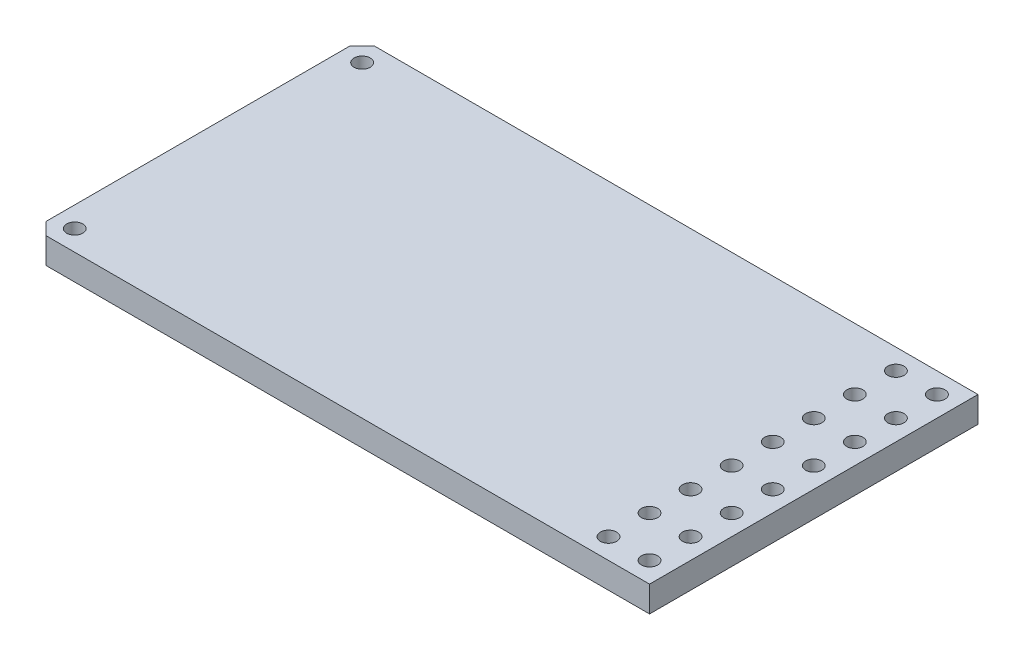
ISO-10303-21;
HEADER;
FILE_DESCRIPTION(('STEP AP214'),'2;1');
FILE_NAME('part.step','',(''),(''),'','','');
FILE_SCHEMA(('AUTOMOTIVE_DESIGN { 1 0 10303 214 1 1 1 1 }'));
ENDSEC;
DATA;
#1=APPLICATION_CONTEXT('core data for automotive mechanical design processes');
#2=APPLICATION_PROTOCOL_DEFINITION('international standard','automotive_design',2000,#1);
#3=PRODUCT_CONTEXT('',#1,'mechanical');
#4=PRODUCT('Part','Part','',(#3));
#5=PRODUCT_RELATED_PRODUCT_CATEGORY('part','',(#4));
#6=PRODUCT_DEFINITION_FORMATION('','',#4);
#7=PRODUCT_DEFINITION_CONTEXT('part definition',#1,'design');
#8=PRODUCT_DEFINITION('design','',#6,#7);
#9=PRODUCT_DEFINITION_SHAPE('','',#8);
#10=(LENGTH_UNIT() NAMED_UNIT(*) SI_UNIT(.MILLI.,.METRE.));
#11=(NAMED_UNIT(*) PLANE_ANGLE_UNIT() SI_UNIT($,.RADIAN.));
#12=(NAMED_UNIT(*) SI_UNIT($,.STERADIAN.) SOLID_ANGLE_UNIT());
#13=UNCERTAINTY_MEASURE_WITH_UNIT(LENGTH_MEASURE(1.E-05),#10,'distance_accuracy_value','');
#14=(GEOMETRIC_REPRESENTATION_CONTEXT(3) GLOBAL_UNCERTAINTY_ASSIGNED_CONTEXT((#13)) GLOBAL_UNIT_ASSIGNED_CONTEXT((#10,
#11,#12)) REPRESENTATION_CONTEXT('',''));
#15=CARTESIAN_POINT('',(0.,0.,0.));
#16=DIRECTION('',(0.,0.,1.));
#17=DIRECTION('',(1.,0.,0.));
#18=AXIS2_PLACEMENT_3D('',#15,#16,#17);
#19=CARTESIAN_POINT('',(-14.224,0.8,14.224));
#20=DIRECTION('',(-0.707106781186548,0.,0.707106781186547));
#21=DIRECTION('',(0.707106781186547,0.,0.707106781186548));
#22=AXIS2_PLACEMENT_3D('',#19,#20,#21);
#23=PLANE('',#22);
#24=DIRECTION('',(-0.707106781186547,0.,-0.707106781186548));
#25=VECTOR('',#24,1.);
#26=CARTESIAN_POINT('',(-14.224,-0.8,14.224));
#27=LINE('',#26,#25);
#28=CARTESIAN_POINT('',(-18.288,-0.8,10.16));
#29=VERTEX_POINT('',#28);
#30=CARTESIAN_POINT('',(-19.05,-0.8,9.39799999999999));
#31=VERTEX_POINT('',#30);
#32=EDGE_CURVE('E206',#29,#31,#27,.T.);
#33=ORIENTED_EDGE('',*,*,#32,.F.);
#34=DIRECTION('',(0.,-1.,0.));
#35=VECTOR('',#34,1.);
#36=CARTESIAN_POINT('',(-18.288,0.8,10.16));
#37=LINE('',#36,#35);
#38=CARTESIAN_POINT('',(-18.288,0.8,10.16));
#39=VERTEX_POINT('',#38);
#40=EDGE_CURVE('E11',#39,#29,#37,.T.);
#41=ORIENTED_EDGE('',*,*,#40,.F.);
#42=DIRECTION('',(-0.707106781186547,0.,-0.707106781186548));
#43=VECTOR('',#42,1.);
#44=CARTESIAN_POINT('',(-14.224,0.8,14.224));
#45=LINE('',#44,#43);
#46=CARTESIAN_POINT('',(-19.05,0.8,9.39799999999999));
#47=VERTEX_POINT('',#46);
#48=EDGE_CURVE('E617',#39,#47,#45,.T.);
#49=ORIENTED_EDGE('',*,*,#48,.T.);
#50=DIRECTION('',(0.,-1.,0.));
#51=VECTOR('',#50,1.);
#52=CARTESIAN_POINT('',(-19.05,0.8,9.39799999999999));
#53=LINE('',#52,#51);
#54=EDGE_CURVE('E61',#47,#31,#53,.T.);
#55=ORIENTED_EDGE('',*,*,#54,.T.);
#56=EDGE_LOOP('',(#33,#41,#49,#55));
#57=FACE_BOUND('',#56,.T.);
#58=ADVANCED_FACE('F43',(#57),#23,.T.);
#59=CARTESIAN_POINT('',(0.,0.8,10.16));
#60=DIRECTION('',(0.,0.,-1.));
#61=DIRECTION('',(-1.,0.,0.));
#62=AXIS2_PLACEMENT_3D('',#59,#60,#61);
#63=PLANE('',#62);
#64=DIRECTION('',(1.,0.,0.));
#65=VECTOR('',#64,1.);
#66=CARTESIAN_POINT('',(0.,-0.8,10.16));
#67=LINE('',#66,#65);
#68=CARTESIAN_POINT('',(19.05,-0.8,10.16));
#69=VERTEX_POINT('',#68);
#70=EDGE_CURVE('E209',#29,#69,#67,.T.);
#71=ORIENTED_EDGE('',*,*,#70,.T.);
#72=DIRECTION('',(0.,-1.,0.));
#73=VECTOR('',#72,1.);
#74=CARTESIAN_POINT('',(19.05,0.8,10.16));
#75=LINE('',#74,#73);
#76=CARTESIAN_POINT('',(19.05,0.8,10.16));
#77=VERTEX_POINT('',#76);
#78=EDGE_CURVE('E53',#77,#69,#75,.T.);
#79=ORIENTED_EDGE('',*,*,#78,.F.);
#80=DIRECTION('',(1.,0.,0.));
#81=VECTOR('',#80,1.);
#82=CARTESIAN_POINT('',(0.,0.8,10.16));
#83=LINE('',#82,#81);
#84=EDGE_CURVE('E128',#39,#77,#83,.T.);
#85=ORIENTED_EDGE('',*,*,#84,.F.);
#86=ORIENTED_EDGE('',*,*,#40,.T.);
#87=EDGE_LOOP('',(#71,#79,#85,#86));
#88=FACE_BOUND('',#87,.T.);
#89=ADVANCED_FACE('F247',(#88),#63,.F.);
#90=CARTESIAN_POINT('',(19.05,0.8,0.));
#91=DIRECTION('',(-1.,0.,0.));
#92=DIRECTION('',(0.,0.,1.));
#93=AXIS2_PLACEMENT_3D('',#90,#91,#92);
#94=PLANE('',#93);
#95=DIRECTION('',(0.,0.,-1.));
#96=VECTOR('',#95,1.);
#97=CARTESIAN_POINT('',(19.05,-0.8,0.));
#98=LINE('',#97,#96);
#99=CARTESIAN_POINT('',(19.05,-0.8,-10.16));
#100=VERTEX_POINT('',#99);
#101=EDGE_CURVE('E213',#69,#100,#98,.T.);
#102=ORIENTED_EDGE('',*,*,#101,.T.);
#103=DIRECTION('',(0.,-1.,0.));
#104=VECTOR('',#103,1.);
#105=CARTESIAN_POINT('',(19.05,0.8,-10.16));
#106=LINE('',#105,#104);
#107=CARTESIAN_POINT('',(19.05,0.8,-10.16));
#108=VERTEX_POINT('',#107);
#109=EDGE_CURVE('E110',#108,#100,#106,.T.);
#110=ORIENTED_EDGE('',*,*,#109,.F.);
#111=DIRECTION('',(0.,0.,-1.));
#112=VECTOR('',#111,1.);
#113=CARTESIAN_POINT('',(19.05,0.8,0.));
#114=LINE('',#113,#112);
#115=EDGE_CURVE('E123',#77,#108,#114,.T.);
#116=ORIENTED_EDGE('',*,*,#115,.F.);
#117=ORIENTED_EDGE('',*,*,#78,.T.);
#118=EDGE_LOOP('',(#102,#110,#116,#117));
#119=FACE_BOUND('',#118,.T.);
#120=ADVANCED_FACE('F244',(#119),#94,.F.);
#121=CARTESIAN_POINT('',(0.,0.8,-10.16));
#122=DIRECTION('',(0.,0.,-1.));
#123=DIRECTION('',(-1.,0.,0.));
#124=AXIS2_PLACEMENT_3D('',#121,#122,#123);
#125=PLANE('',#124);
#126=DIRECTION('',(1.,0.,0.));
#127=VECTOR('',#126,1.);
#128=CARTESIAN_POINT('',(0.,-0.8,-10.16));
#129=LINE('',#128,#127);
#130=CARTESIAN_POINT('',(-18.288,-0.8,-10.16));
#131=VERTEX_POINT('',#130);
#132=EDGE_CURVE('E106',#131,#100,#129,.T.);
#133=ORIENTED_EDGE('',*,*,#132,.F.);
#134=DIRECTION('',(0.,-1.,0.));
#135=VECTOR('',#134,1.);
#136=CARTESIAN_POINT('',(-18.288,0.8,-10.16));
#137=LINE('',#136,#135);
#138=CARTESIAN_POINT('',(-18.288,0.8,-10.16));
#139=VERTEX_POINT('',#138);
#140=EDGE_CURVE('E100',#139,#131,#137,.T.);
#141=ORIENTED_EDGE('',*,*,#140,.F.);
#142=DIRECTION('',(1.,0.,0.));
#143=VECTOR('',#142,1.);
#144=CARTESIAN_POINT('',(0.,0.8,-10.16));
#145=LINE('',#144,#143);
#146=EDGE_CURVE('E104',#139,#108,#145,.T.);
#147=ORIENTED_EDGE('',*,*,#146,.T.);
#148=ORIENTED_EDGE('',*,*,#109,.T.);
#149=EDGE_LOOP('',(#133,#141,#147,#148));
#150=FACE_BOUND('',#149,.T.);
#151=ADVANCED_FACE('F102',(#150),#125,.T.);
#152=CARTESIAN_POINT('',(-14.224,0.8,-14.224));
#153=DIRECTION('',(0.707106781186548,0.,0.707106781186547));
#154=DIRECTION('',(0.707106781186547,0.,-0.707106781186548));
#155=AXIS2_PLACEMENT_3D('',#152,#153,#154);
#156=PLANE('',#155);
#157=DIRECTION('',(-0.707106781186547,0.,0.707106781186548));
#158=VECTOR('',#157,1.);
#159=CARTESIAN_POINT('',(-14.224,-0.8,-14.224));
#160=LINE('',#159,#158);
#161=CARTESIAN_POINT('',(-19.05,-0.8,-9.39799999999999));
#162=VERTEX_POINT('',#161);
#163=EDGE_CURVE('E219',#131,#162,#160,.T.);
#164=ORIENTED_EDGE('',*,*,#163,.T.);
#165=DIRECTION('',(0.,-1.,0.));
#166=VECTOR('',#165,1.);
#167=CARTESIAN_POINT('',(-19.05,0.8,-9.39799999999999));
#168=LINE('',#167,#166);
#169=CARTESIAN_POINT('',(-19.05,0.8,-9.39799999999999));
#170=VERTEX_POINT('',#169);
#171=EDGE_CURVE('E81',#170,#162,#168,.T.);
#172=ORIENTED_EDGE('',*,*,#171,.F.);
#173=DIRECTION('',(-0.707106781186547,0.,0.707106781186548));
#174=VECTOR('',#173,1.);
#175=CARTESIAN_POINT('',(-14.224,0.8,-14.224));
#176=LINE('',#175,#174);
#177=EDGE_CURVE('E112',#139,#170,#176,.T.);
#178=ORIENTED_EDGE('',*,*,#177,.F.);
#179=ORIENTED_EDGE('',*,*,#140,.T.);
#180=EDGE_LOOP('',(#164,#172,#178,#179));
#181=FACE_BOUND('',#180,.T.);
#182=ADVANCED_FACE('F113',(#181),#156,.F.);
#183=CARTESIAN_POINT('',(-17.78,0.8,-8.89));
#184=DIRECTION('',(0.,-1.,0.));
#185=DIRECTION('',(0.,0.,-1.));
#186=AXIS2_PLACEMENT_3D('',#183,#184,#185);
#187=CYLINDRICAL_SURFACE('',#186,0.499999999999999);
#188=CARTESIAN_POINT('',(-17.78,0.8,-8.89));
#189=DIRECTION('',(0.,1.,0.));
#190=DIRECTION('',(0.,0.,1.));
#191=AXIS2_PLACEMENT_3D('',#188,#189,#190);
#192=CIRCLE('',#191,0.499999999999999);
#193=CARTESIAN_POINT('',(-17.78,0.8,-8.39));
#194=VERTEX_POINT('',#193);
#195=EDGE_CURVE('E134',#194,#194,#192,.T.);
#196=ORIENTED_EDGE('',*,*,#195,.T.);
#197=EDGE_LOOP('',(#196));
#198=FACE_BOUND('',#197,.T.);
#199=CARTESIAN_POINT('',(-17.78,-0.8,-8.89));
#200=DIRECTION('',(0.,1.,0.));
#201=DIRECTION('',(0.,0.,1.));
#202=AXIS2_PLACEMENT_3D('',#199,#200,#201);
#203=CIRCLE('',#202,0.499999999999999);
#204=CARTESIAN_POINT('',(-17.78,-0.8,-8.39));
#205=VERTEX_POINT('',#204);
#206=EDGE_CURVE('E226',#205,#205,#203,.T.);
#207=ORIENTED_EDGE('',*,*,#206,.F.);
#208=EDGE_LOOP('',(#207));
#209=FACE_BOUND('',#208,.T.);
#210=ADVANCED_FACE('F383',(#198,#209),#187,.F.);
#211=CARTESIAN_POINT('',(-19.05,0.8,0.));
#212=DIRECTION('',(-1.,0.,0.));
#213=DIRECTION('',(0.,0.,1.));
#214=AXIS2_PLACEMENT_3D('',#211,#212,#213);
#215=PLANE('',#214);
#216=DIRECTION('',(0.,0.,-1.));
#217=VECTOR('',#216,1.);
#218=CARTESIAN_POINT('',(-19.05,-0.8,0.));
#219=LINE('',#218,#217);
#220=EDGE_CURVE('E222',#31,#162,#219,.T.);
#221=ORIENTED_EDGE('',*,*,#220,.F.);
#222=ORIENTED_EDGE('',*,*,#54,.F.);
#223=DIRECTION('',(0.,0.,-1.));
#224=VECTOR('',#223,1.);
#225=CARTESIAN_POINT('',(-19.05,0.8,0.));
#226=LINE('',#225,#224);
#227=EDGE_CURVE('E117',#47,#170,#226,.T.);
#228=ORIENTED_EDGE('',*,*,#227,.T.);
#229=ORIENTED_EDGE('',*,*,#171,.T.);
#230=EDGE_LOOP('',(#221,#222,#228,#229));
#231=FACE_BOUND('',#230,.T.);
#232=ADVANCED_FACE('F263',(#231),#215,.T.);
#233=CARTESIAN_POINT('',(17.78,0.8,-8.89));
#234=DIRECTION('',(0.,-1.,0.));
#235=DIRECTION('',(0.,0.,-1.));
#236=AXIS2_PLACEMENT_3D('',#233,#234,#235);
#237=CYLINDRICAL_SURFACE('',#236,0.499999999999999);
#238=CARTESIAN_POINT('',(17.78,0.8,-8.89));
#239=DIRECTION('',(0.,1.,0.));
#240=DIRECTION('',(0.,0.,1.));
#241=AXIS2_PLACEMENT_3D('',#238,#239,#240);
#242=CIRCLE('',#241,0.499999999999999);
#243=CARTESIAN_POINT('',(17.78,0.8,-8.39));
#244=VERTEX_POINT('',#243);
#245=EDGE_CURVE('E615',#244,#244,#242,.T.);
#246=ORIENTED_EDGE('',*,*,#245,.T.);
#247=EDGE_LOOP('',(#246));
#248=FACE_BOUND('',#247,.T.);
#249=CARTESIAN_POINT('',(17.78,-0.8,-8.89));
#250=DIRECTION('',(0.,1.,0.));
#251=DIRECTION('',(0.,0.,1.));
#252=AXIS2_PLACEMENT_3D('',#249,#250,#251);
#253=CIRCLE('',#252,0.499999999999999);
#254=CARTESIAN_POINT('',(17.78,-0.8,-8.39));
#255=VERTEX_POINT('',#254);
#256=EDGE_CURVE('E202',#255,#255,#253,.T.);
#257=ORIENTED_EDGE('',*,*,#256,.F.);
#258=EDGE_LOOP('',(#257));
#259=FACE_BOUND('',#258,.T.);
#260=ADVANCED_FACE('F259',(#248,#259),#237,.F.);
#261=CARTESIAN_POINT('',(15.24,0.8,-8.89));
#262=DIRECTION('',(0.,-1.,0.));
#263=DIRECTION('',(0.,0.,-1.));
#264=AXIS2_PLACEMENT_3D('',#261,#262,#263);
#265=CYLINDRICAL_SURFACE('',#264,0.499999999999995);
#266=CARTESIAN_POINT('',(15.24,0.8,-8.89));
#267=DIRECTION('',(0.,1.,0.));
#268=DIRECTION('',(0.,0.,1.));
#269=AXIS2_PLACEMENT_3D('',#266,#267,#268);
#270=CIRCLE('',#269,0.499999999999995);
#271=CARTESIAN_POINT('',(15.24,0.8,-8.39));
#272=VERTEX_POINT('',#271);
#273=EDGE_CURVE('E612',#272,#272,#270,.T.);
#274=ORIENTED_EDGE('',*,*,#273,.T.);
#275=EDGE_LOOP('',(#274));
#276=FACE_BOUND('',#275,.T.);
#277=CARTESIAN_POINT('',(15.24,-0.8,-8.89));
#278=DIRECTION('',(0.,1.,0.));
#279=DIRECTION('',(0.,0.,1.));
#280=AXIS2_PLACEMENT_3D('',#277,#278,#279);
#281=CIRCLE('',#280,0.499999999999995);
#282=CARTESIAN_POINT('',(15.24,-0.8,-8.39));
#283=VERTEX_POINT('',#282);
#284=EDGE_CURVE('E198',#283,#283,#281,.T.);
#285=ORIENTED_EDGE('',*,*,#284,.F.);
#286=EDGE_LOOP('',(#285));
#287=FACE_BOUND('',#286,.T.);
#288=ADVANCED_FACE('F262',(#276,#287),#265,.F.);
#289=CARTESIAN_POINT('',(15.24,0.8,-6.35));
#290=DIRECTION('',(0.,-1.,0.));
#291=DIRECTION('',(0.,0.,-1.));
#292=AXIS2_PLACEMENT_3D('',#289,#290,#291);
#293=CYLINDRICAL_SURFACE('',#292,0.499999999999997);
#294=CARTESIAN_POINT('',(15.24,0.8,-6.35));
#295=DIRECTION('',(0.,1.,0.));
#296=DIRECTION('',(0.,0.,1.));
#297=AXIS2_PLACEMENT_3D('',#294,#295,#296);
#298=CIRCLE('',#297,0.499999999999997);
#299=CARTESIAN_POINT('',(15.24,0.8,-5.85));
#300=VERTEX_POINT('',#299);
#301=EDGE_CURVE('E608',#300,#300,#298,.T.);
#302=ORIENTED_EDGE('',*,*,#301,.T.);
#303=EDGE_LOOP('',(#302));
#304=FACE_BOUND('',#303,.T.);
#305=CARTESIAN_POINT('',(15.24,-0.8,-6.35));
#306=DIRECTION('',(0.,1.,0.));
#307=DIRECTION('',(0.,0.,1.));
#308=AXIS2_PLACEMENT_3D('',#305,#306,#307);
#309=CIRCLE('',#308,0.499999999999997);
#310=CARTESIAN_POINT('',(15.24,-0.8,-5.85));
#311=VERTEX_POINT('',#310);
#312=EDGE_CURVE('E194',#311,#311,#309,.T.);
#313=ORIENTED_EDGE('',*,*,#312,.F.);
#314=EDGE_LOOP('',(#313));
#315=FACE_BOUND('',#314,.T.);
#316=ADVANCED_FACE('F267',(#304,#315),#293,.F.);
#317=CARTESIAN_POINT('',(17.78,0.8,-6.35));
#318=DIRECTION('',(0.,-1.,0.));
#319=DIRECTION('',(0.,0.,-1.));
#320=AXIS2_PLACEMENT_3D('',#317,#318,#319);
#321=CYLINDRICAL_SURFACE('',#320,0.499999999999999);
#322=CARTESIAN_POINT('',(17.78,0.8,-6.35));
#323=DIRECTION('',(0.,1.,0.));
#324=DIRECTION('',(0.,0.,1.));
#325=AXIS2_PLACEMENT_3D('',#322,#323,#324);
#326=CIRCLE('',#325,0.499999999999999);
#327=CARTESIAN_POINT('',(17.78,0.8,-5.85));
#328=VERTEX_POINT('',#327);
#329=EDGE_CURVE('E604',#328,#328,#326,.T.);
#330=ORIENTED_EDGE('',*,*,#329,.T.);
#331=EDGE_LOOP('',(#330));
#332=FACE_BOUND('',#331,.T.);
#333=CARTESIAN_POINT('',(17.78,-0.8,-6.35));
#334=DIRECTION('',(0.,1.,0.));
#335=DIRECTION('',(0.,0.,1.));
#336=AXIS2_PLACEMENT_3D('',#333,#334,#335);
#337=CIRCLE('',#336,0.499999999999999);
#338=CARTESIAN_POINT('',(17.78,-0.8,-5.85));
#339=VERTEX_POINT('',#338);
#340=EDGE_CURVE('E190',#339,#339,#337,.T.);
#341=ORIENTED_EDGE('',*,*,#340,.F.);
#342=EDGE_LOOP('',(#341));
#343=FACE_BOUND('',#342,.T.);
#344=ADVANCED_FACE('F271',(#332,#343),#321,.F.);
#345=CARTESIAN_POINT('',(15.24,0.8,-3.81));
#346=DIRECTION('',(0.,-1.,0.));
#347=DIRECTION('',(0.,0.,-1.));
#348=AXIS2_PLACEMENT_3D('',#345,#346,#347);
#349=CYLINDRICAL_SURFACE('',#348,0.499999999999996);
#350=CARTESIAN_POINT('',(15.24,0.8,-3.81));
#351=DIRECTION('',(0.,1.,0.));
#352=DIRECTION('',(0.,0.,1.));
#353=AXIS2_PLACEMENT_3D('',#350,#351,#352);
#354=CIRCLE('',#353,0.499999999999996);
#355=CARTESIAN_POINT('',(15.24,0.8,-3.31));
#356=VERTEX_POINT('',#355);
#357=EDGE_CURVE('E600',#356,#356,#354,.T.);
#358=ORIENTED_EDGE('',*,*,#357,.T.);
#359=EDGE_LOOP('',(#358));
#360=FACE_BOUND('',#359,.T.);
#361=CARTESIAN_POINT('',(15.24,-0.8,-3.81));
#362=DIRECTION('',(0.,1.,0.));
#363=DIRECTION('',(0.,0.,1.));
#364=AXIS2_PLACEMENT_3D('',#361,#362,#363);
#365=CIRCLE('',#364,0.499999999999996);
#366=CARTESIAN_POINT('',(15.24,-0.8,-3.31));
#367=VERTEX_POINT('',#366);
#368=EDGE_CURVE('E186',#367,#367,#365,.T.);
#369=ORIENTED_EDGE('',*,*,#368,.F.);
#370=EDGE_LOOP('',(#369));
#371=FACE_BOUND('',#370,.T.);
#372=ADVANCED_FACE('F275',(#360,#371),#349,.F.);
#373=CARTESIAN_POINT('',(17.7800000000001,0.8,-3.81));
#374=DIRECTION('',(0.,-1.,0.));
#375=DIRECTION('',(0.,0.,-1.));
#376=AXIS2_PLACEMENT_3D('',#373,#374,#375);
#377=CYLINDRICAL_SURFACE('',#376,0.499999999999999);
#378=CARTESIAN_POINT('',(17.7800000000001,0.8,-3.81));
#379=DIRECTION('',(0.,1.,0.));
#380=DIRECTION('',(0.,0.,1.));
#381=AXIS2_PLACEMENT_3D('',#378,#379,#380);
#382=CIRCLE('',#381,0.499999999999999);
#383=CARTESIAN_POINT('',(17.7800000000001,0.8,-3.31));
#384=VERTEX_POINT('',#383);
#385=EDGE_CURVE('E596',#384,#384,#382,.T.);
#386=ORIENTED_EDGE('',*,*,#385,.T.);
#387=EDGE_LOOP('',(#386));
#388=FACE_BOUND('',#387,.T.);
#389=CARTESIAN_POINT('',(17.7800000000001,-0.8,-3.81));
#390=DIRECTION('',(0.,1.,0.));
#391=DIRECTION('',(0.,0.,1.));
#392=AXIS2_PLACEMENT_3D('',#389,#390,#391);
#393=CIRCLE('',#392,0.499999999999999);
#394=CARTESIAN_POINT('',(17.7800000000001,-0.8,-3.31));
#395=VERTEX_POINT('',#394);
#396=EDGE_CURVE('E182',#395,#395,#393,.T.);
#397=ORIENTED_EDGE('',*,*,#396,.F.);
#398=EDGE_LOOP('',(#397));
#399=FACE_BOUND('',#398,.T.);
#400=ADVANCED_FACE('F279',(#388,#399),#377,.F.);
#401=CARTESIAN_POINT('',(15.2400000000001,0.8,-1.27));
#402=DIRECTION('',(0.,-1.,0.));
#403=DIRECTION('',(0.,0.,-1.));
#404=AXIS2_PLACEMENT_3D('',#401,#402,#403);
#405=CYLINDRICAL_SURFACE('',#404,0.499999999999995);
#406=CARTESIAN_POINT('',(15.2400000000001,0.8,-1.27));
#407=DIRECTION('',(0.,1.,0.));
#408=DIRECTION('',(0.,0.,1.));
#409=AXIS2_PLACEMENT_3D('',#406,#407,#408);
#410=CIRCLE('',#409,0.499999999999995);
#411=CARTESIAN_POINT('',(15.2400000000001,0.8,-0.770000000000003));
#412=VERTEX_POINT('',#411);
#413=EDGE_CURVE('E592',#412,#412,#410,.T.);
#414=ORIENTED_EDGE('',*,*,#413,.T.);
#415=EDGE_LOOP('',(#414));
#416=FACE_BOUND('',#415,.T.);
#417=CARTESIAN_POINT('',(15.2400000000001,-0.8,-1.27));
#418=DIRECTION('',(0.,1.,0.));
#419=DIRECTION('',(0.,0.,1.));
#420=AXIS2_PLACEMENT_3D('',#417,#418,#419);
#421=CIRCLE('',#420,0.499999999999995);
#422=CARTESIAN_POINT('',(15.2400000000001,-0.8,-0.770000000000003));
#423=VERTEX_POINT('',#422);
#424=EDGE_CURVE('E178',#423,#423,#421,.T.);
#425=ORIENTED_EDGE('',*,*,#424,.F.);
#426=EDGE_LOOP('',(#425));
#427=FACE_BOUND('',#426,.T.);
#428=ADVANCED_FACE('F283',(#416,#427),#405,.F.);
#429=CARTESIAN_POINT('',(17.7800000000001,0.8,-1.27));
#430=DIRECTION('',(0.,-1.,0.));
#431=DIRECTION('',(0.,0.,-1.));
#432=AXIS2_PLACEMENT_3D('',#429,#430,#431);
#433=CYLINDRICAL_SURFACE('',#432,0.499999999999999);
#434=CARTESIAN_POINT('',(17.7800000000001,0.8,-1.27));
#435=DIRECTION('',(0.,1.,0.));
#436=DIRECTION('',(0.,0.,1.));
#437=AXIS2_PLACEMENT_3D('',#434,#435,#436);
#438=CIRCLE('',#437,0.499999999999999);
#439=CARTESIAN_POINT('',(17.7800000000001,0.8,-0.77));
#440=VERTEX_POINT('',#439);
#441=EDGE_CURVE('E588',#440,#440,#438,.T.);
#442=ORIENTED_EDGE('',*,*,#441,.T.);
#443=EDGE_LOOP('',(#442));
#444=FACE_BOUND('',#443,.T.);
#445=CARTESIAN_POINT('',(17.7800000000001,-0.8,-1.27));
#446=DIRECTION('',(0.,1.,0.));
#447=DIRECTION('',(0.,0.,1.));
#448=AXIS2_PLACEMENT_3D('',#445,#446,#447);
#449=CIRCLE('',#448,0.499999999999999);
#450=CARTESIAN_POINT('',(17.7800000000001,-0.8,-0.77));
#451=VERTEX_POINT('',#450);
#452=EDGE_CURVE('E174',#451,#451,#449,.T.);
#453=ORIENTED_EDGE('',*,*,#452,.F.);
#454=EDGE_LOOP('',(#453));
#455=FACE_BOUND('',#454,.T.);
#456=ADVANCED_FACE('F287',(#444,#455),#433,.F.);
#457=CARTESIAN_POINT('',(15.2400000000001,0.8,1.27));
#458=DIRECTION('',(0.,-1.,0.));
#459=DIRECTION('',(0.,0.,-1.));
#460=AXIS2_PLACEMENT_3D('',#457,#458,#459);
#461=CYLINDRICAL_SURFACE('',#460,0.499999999999994);
#462=CARTESIAN_POINT('',(15.2400000000001,0.8,1.27));
#463=DIRECTION('',(0.,1.,0.));
#464=DIRECTION('',(0.,0.,1.));
#465=AXIS2_PLACEMENT_3D('',#462,#463,#464);
#466=CIRCLE('',#465,0.499999999999994);
#467=CARTESIAN_POINT('',(15.2400000000001,0.8,1.77));
#468=VERTEX_POINT('',#467);
#469=EDGE_CURVE('E584',#468,#468,#466,.T.);
#470=ORIENTED_EDGE('',*,*,#469,.T.);
#471=EDGE_LOOP('',(#470));
#472=FACE_BOUND('',#471,.T.);
#473=CARTESIAN_POINT('',(15.2400000000001,-0.8,1.27));
#474=DIRECTION('',(0.,1.,0.));
#475=DIRECTION('',(0.,0.,1.));
#476=AXIS2_PLACEMENT_3D('',#473,#474,#475);
#477=CIRCLE('',#476,0.499999999999994);
#478=CARTESIAN_POINT('',(15.2400000000001,-0.8,1.77));
#479=VERTEX_POINT('',#478);
#480=EDGE_CURVE('E170',#479,#479,#477,.T.);
#481=ORIENTED_EDGE('',*,*,#480,.F.);
#482=EDGE_LOOP('',(#481));
#483=FACE_BOUND('',#482,.T.);
#484=ADVANCED_FACE('F291',(#472,#483),#461,.F.);
#485=CARTESIAN_POINT('',(17.7800000000001,0.8,1.27));
#486=DIRECTION('',(0.,-1.,0.));
#487=DIRECTION('',(0.,0.,-1.));
#488=AXIS2_PLACEMENT_3D('',#485,#486,#487);
#489=CYLINDRICAL_SURFACE('',#488,0.499999999999999);
#490=CARTESIAN_POINT('',(17.7800000000001,0.8,1.27));
#491=DIRECTION('',(0.,1.,0.));
#492=DIRECTION('',(0.,0.,1.));
#493=AXIS2_PLACEMENT_3D('',#490,#491,#492);
#494=CIRCLE('',#493,0.499999999999999);
#495=CARTESIAN_POINT('',(17.7800000000001,0.8,1.77));
#496=VERTEX_POINT('',#495);
#497=EDGE_CURVE('E580',#496,#496,#494,.T.);
#498=ORIENTED_EDGE('',*,*,#497,.T.);
#499=EDGE_LOOP('',(#498));
#500=FACE_BOUND('',#499,.T.);
#501=CARTESIAN_POINT('',(17.7800000000001,-0.8,1.27));
#502=DIRECTION('',(0.,1.,0.));
#503=DIRECTION('',(0.,0.,1.));
#504=AXIS2_PLACEMENT_3D('',#501,#502,#503);
#505=CIRCLE('',#504,0.499999999999999);
#506=CARTESIAN_POINT('',(17.7800000000001,-0.8,1.77));
#507=VERTEX_POINT('',#506);
#508=EDGE_CURVE('E166',#507,#507,#505,.T.);
#509=ORIENTED_EDGE('',*,*,#508,.F.);
#510=EDGE_LOOP('',(#509));
#511=FACE_BOUND('',#510,.T.);
#512=ADVANCED_FACE('F295',(#500,#511),#489,.F.);
#513=CARTESIAN_POINT('',(15.2400000000001,0.8,3.81));
#514=DIRECTION('',(0.,-1.,0.));
#515=DIRECTION('',(0.,0.,-1.));
#516=AXIS2_PLACEMENT_3D('',#513,#514,#515);
#517=CYLINDRICAL_SURFACE('',#516,0.499999999999995);
#518=CARTESIAN_POINT('',(15.2400000000001,0.8,3.81));
#519=DIRECTION('',(0.,1.,0.));
#520=DIRECTION('',(0.,0.,1.));
#521=AXIS2_PLACEMENT_3D('',#518,#519,#520);
#522=CIRCLE('',#521,0.499999999999995);
#523=CARTESIAN_POINT('',(15.2400000000001,0.8,4.31));
#524=VERTEX_POINT('',#523);
#525=EDGE_CURVE('E576',#524,#524,#522,.T.);
#526=ORIENTED_EDGE('',*,*,#525,.T.);
#527=EDGE_LOOP('',(#526));
#528=FACE_BOUND('',#527,.T.);
#529=CARTESIAN_POINT('',(15.2400000000001,-0.8,3.81));
#530=DIRECTION('',(0.,1.,0.));
#531=DIRECTION('',(0.,0.,1.));
#532=AXIS2_PLACEMENT_3D('',#529,#530,#531);
#533=CIRCLE('',#532,0.499999999999995);
#534=CARTESIAN_POINT('',(15.2400000000001,-0.8,4.31));
#535=VERTEX_POINT('',#534);
#536=EDGE_CURVE('E162',#535,#535,#533,.T.);
#537=ORIENTED_EDGE('',*,*,#536,.F.);
#538=EDGE_LOOP('',(#537));
#539=FACE_BOUND('',#538,.T.);
#540=ADVANCED_FACE('F299',(#528,#539),#517,.F.);
#541=CARTESIAN_POINT('',(17.7800000000001,0.8,3.81));
#542=DIRECTION('',(0.,-1.,0.));
#543=DIRECTION('',(0.,0.,-1.));
#544=AXIS2_PLACEMENT_3D('',#541,#542,#543);
#545=CYLINDRICAL_SURFACE('',#544,0.499999999999999);
#546=CARTESIAN_POINT('',(17.7800000000001,0.8,3.81));
#547=DIRECTION('',(0.,1.,0.));
#548=DIRECTION('',(0.,0.,1.));
#549=AXIS2_PLACEMENT_3D('',#546,#547,#548);
#550=CIRCLE('',#549,0.499999999999999);
#551=CARTESIAN_POINT('',(17.7800000000001,0.8,4.31));
#552=VERTEX_POINT('',#551);
#553=EDGE_CURVE('E572',#552,#552,#550,.T.);
#554=ORIENTED_EDGE('',*,*,#553,.T.);
#555=EDGE_LOOP('',(#554));
#556=FACE_BOUND('',#555,.T.);
#557=CARTESIAN_POINT('',(17.7800000000001,-0.8,3.81));
#558=DIRECTION('',(0.,1.,0.));
#559=DIRECTION('',(0.,0.,1.));
#560=AXIS2_PLACEMENT_3D('',#557,#558,#559);
#561=CIRCLE('',#560,0.499999999999999);
#562=CARTESIAN_POINT('',(17.7800000000001,-0.8,4.31));
#563=VERTEX_POINT('',#562);
#564=EDGE_CURVE('E158',#563,#563,#561,.T.);
#565=ORIENTED_EDGE('',*,*,#564,.F.);
#566=EDGE_LOOP('',(#565));
#567=FACE_BOUND('',#566,.T.);
#568=ADVANCED_FACE('F303',(#556,#567),#545,.F.);
#569=CARTESIAN_POINT('',(15.2400000000002,0.8,6.35));
#570=DIRECTION('',(0.,-1.,0.));
#571=DIRECTION('',(0.,0.,-1.));
#572=AXIS2_PLACEMENT_3D('',#569,#570,#571);
#573=CYLINDRICAL_SURFACE('',#572,0.499999999999997);
#574=CARTESIAN_POINT('',(15.2400000000002,0.8,6.35));
#575=DIRECTION('',(0.,1.,0.));
#576=DIRECTION('',(0.,0.,1.));
#577=AXIS2_PLACEMENT_3D('',#574,#575,#576);
#578=CIRCLE('',#577,0.499999999999997);
#579=CARTESIAN_POINT('',(15.2400000000002,0.8,6.85));
#580=VERTEX_POINT('',#579);
#581=EDGE_CURVE('E568',#580,#580,#578,.T.);
#582=ORIENTED_EDGE('',*,*,#581,.T.);
#583=EDGE_LOOP('',(#582));
#584=FACE_BOUND('',#583,.T.);
#585=CARTESIAN_POINT('',(15.2400000000002,-0.8,6.35));
#586=DIRECTION('',(0.,1.,0.));
#587=DIRECTION('',(0.,0.,1.));
#588=AXIS2_PLACEMENT_3D('',#585,#586,#587);
#589=CIRCLE('',#588,0.499999999999997);
#590=CARTESIAN_POINT('',(15.2400000000002,-0.8,6.85));
#591=VERTEX_POINT('',#590);
#592=EDGE_CURVE('E154',#591,#591,#589,.T.);
#593=ORIENTED_EDGE('',*,*,#592,.F.);
#594=EDGE_LOOP('',(#593));
#595=FACE_BOUND('',#594,.T.);
#596=ADVANCED_FACE('F307',(#584,#595),#573,.F.);
#597=CARTESIAN_POINT('',(17.7800000000002,0.8,6.35));
#598=DIRECTION('',(0.,-1.,0.));
#599=DIRECTION('',(0.,0.,-1.));
#600=AXIS2_PLACEMENT_3D('',#597,#598,#599);
#601=CYLINDRICAL_SURFACE('',#600,0.499999999999999);
#602=CARTESIAN_POINT('',(17.7800000000002,0.8,6.35));
#603=DIRECTION('',(0.,1.,0.));
#604=DIRECTION('',(0.,0.,1.));
#605=AXIS2_PLACEMENT_3D('',#602,#603,#604);
#606=CIRCLE('',#605,0.499999999999999);
#607=CARTESIAN_POINT('',(17.7800000000002,0.8,6.85));
#608=VERTEX_POINT('',#607);
#609=EDGE_CURVE('E564',#608,#608,#606,.T.);
#610=ORIENTED_EDGE('',*,*,#609,.T.);
#611=EDGE_LOOP('',(#610));
#612=FACE_BOUND('',#611,.T.);
#613=CARTESIAN_POINT('',(17.7800000000002,-0.8,6.35));
#614=DIRECTION('',(0.,1.,0.));
#615=DIRECTION('',(0.,0.,1.));
#616=AXIS2_PLACEMENT_3D('',#613,#614,#615);
#617=CIRCLE('',#616,0.499999999999999);
#618=CARTESIAN_POINT('',(17.7800000000002,-0.8,6.85));
#619=VERTEX_POINT('',#618);
#620=EDGE_CURVE('E150',#619,#619,#617,.T.);
#621=ORIENTED_EDGE('',*,*,#620,.F.);
#622=EDGE_LOOP('',(#621));
#623=FACE_BOUND('',#622,.T.);
#624=ADVANCED_FACE('F311',(#612,#623),#601,.F.);
#625=CARTESIAN_POINT('',(15.2400000000002,0.8,8.89));
#626=DIRECTION('',(0.,-1.,0.));
#627=DIRECTION('',(0.,0.,-1.));
#628=AXIS2_PLACEMENT_3D('',#625,#626,#627);
#629=CYLINDRICAL_SURFACE('',#628,0.499999999999994);
#630=CARTESIAN_POINT('',(15.2400000000002,0.8,8.89));
#631=DIRECTION('',(0.,1.,0.));
#632=DIRECTION('',(0.,0.,1.));
#633=AXIS2_PLACEMENT_3D('',#630,#631,#632);
#634=CIRCLE('',#633,0.499999999999994);
#635=CARTESIAN_POINT('',(15.2400000000002,0.8,9.39));
#636=VERTEX_POINT('',#635);
#637=EDGE_CURVE('E326',#636,#636,#634,.T.);
#638=ORIENTED_EDGE('',*,*,#637,.T.);
#639=EDGE_LOOP('',(#638));
#640=FACE_BOUND('',#639,.T.);
#641=CARTESIAN_POINT('',(15.2400000000002,-0.8,8.89));
#642=DIRECTION('',(0.,1.,0.));
#643=DIRECTION('',(0.,0.,1.));
#644=AXIS2_PLACEMENT_3D('',#641,#642,#643);
#645=CIRCLE('',#644,0.499999999999994);
#646=CARTESIAN_POINT('',(15.2400000000002,-0.8,9.39));
#647=VERTEX_POINT('',#646);
#648=EDGE_CURVE('E146',#647,#647,#645,.T.);
#649=ORIENTED_EDGE('',*,*,#648,.F.);
#650=EDGE_LOOP('',(#649));
#651=FACE_BOUND('',#650,.T.);
#652=ADVANCED_FACE('F314',(#640,#651),#629,.F.);
#653=CARTESIAN_POINT('',(17.7800000000002,0.8,8.89));
#654=DIRECTION('',(0.,-1.,0.));
#655=DIRECTION('',(0.,0.,-1.));
#656=AXIS2_PLACEMENT_3D('',#653,#654,#655);
#657=CYLINDRICAL_SURFACE('',#656,0.499999999999999);
#658=CARTESIAN_POINT('',(17.7800000000002,0.8,8.89));
#659=DIRECTION('',(0.,1.,0.));
#660=DIRECTION('',(0.,0.,1.));
#661=AXIS2_PLACEMENT_3D('',#658,#659,#660);
#662=CIRCLE('',#661,0.499999999999999);
#663=CARTESIAN_POINT('',(17.7800000000002,0.8,9.39));
#664=VERTEX_POINT('',#663);
#665=EDGE_CURVE('E234',#664,#664,#662,.T.);
#666=ORIENTED_EDGE('',*,*,#665,.T.);
#667=EDGE_LOOP('',(#666));
#668=FACE_BOUND('',#667,.T.);
#669=CARTESIAN_POINT('',(17.7800000000002,-0.8,8.89));
#670=DIRECTION('',(0.,1.,0.));
#671=DIRECTION('',(0.,0.,1.));
#672=AXIS2_PLACEMENT_3D('',#669,#670,#671);
#673=CIRCLE('',#672,0.499999999999999);
#674=CARTESIAN_POINT('',(17.7800000000002,-0.8,9.39));
#675=VERTEX_POINT('',#674);
#676=EDGE_CURVE('E142',#675,#675,#673,.T.);
#677=ORIENTED_EDGE('',*,*,#676,.F.);
#678=EDGE_LOOP('',(#677));
#679=FACE_BOUND('',#678,.T.);
#680=ADVANCED_FACE('F45',(#668,#679),#657,.F.);
#681=CARTESIAN_POINT('',(-17.78,0.8,8.89));
#682=DIRECTION('',(0.,-1.,0.));
#683=DIRECTION('',(0.,0.,-1.));
#684=AXIS2_PLACEMENT_3D('',#681,#682,#683);
#685=CYLINDRICAL_SURFACE('',#684,0.499999999999999);
#686=CARTESIAN_POINT('',(-17.78,0.8,8.89));
#687=DIRECTION('',(0.,1.,0.));
#688=DIRECTION('',(0.,0.,1.));
#689=AXIS2_PLACEMENT_3D('',#686,#687,#688);
#690=CIRCLE('',#689,0.499999999999999);
#691=CARTESIAN_POINT('',(-17.78,0.8,9.39));
#692=VERTEX_POINT('',#691);
#693=EDGE_CURVE('E138',#692,#692,#690,.F.);
#694=ORIENTED_EDGE('',*,*,#693,.F.);
#695=EDGE_LOOP('',(#694));
#696=FACE_BOUND('',#695,.T.);
#697=CARTESIAN_POINT('',(-17.78,-0.8,8.89));
#698=DIRECTION('',(0.,1.,0.));
#699=DIRECTION('',(0.,0.,1.));
#700=AXIS2_PLACEMENT_3D('',#697,#698,#699);
#701=CIRCLE('',#700,0.499999999999999);
#702=CARTESIAN_POINT('',(-17.78,-0.8,9.39));
#703=VERTEX_POINT('',#702);
#704=EDGE_CURVE('E230',#703,#703,#701,.F.);
#705=ORIENTED_EDGE('',*,*,#704,.T.);
#706=EDGE_LOOP('',(#705));
#707=FACE_BOUND('',#706,.T.);
#708=ADVANCED_FACE('F321',(#696,#707),#685,.F.);
#709=CARTESIAN_POINT('',(0.,0.8,0.));
#710=DIRECTION('',(0.,1.,0.));
#711=DIRECTION('',(0.,0.,1.));
#712=AXIS2_PLACEMENT_3D('',#709,#710,#711);
#713=PLANE('',#712);
#714=ORIENTED_EDGE('',*,*,#665,.F.);
#715=EDGE_LOOP('',(#714));
#716=FACE_BOUND('',#715,.T.);
#717=ORIENTED_EDGE('',*,*,#637,.F.);
#718=EDGE_LOOP('',(#717));
#719=FACE_BOUND('',#718,.T.);
#720=ORIENTED_EDGE('',*,*,#609,.F.);
#721=EDGE_LOOP('',(#720));
#722=FACE_BOUND('',#721,.T.);
#723=ORIENTED_EDGE('',*,*,#581,.F.);
#724=EDGE_LOOP('',(#723));
#725=FACE_BOUND('',#724,.T.);
#726=ORIENTED_EDGE('',*,*,#553,.F.);
#727=EDGE_LOOP('',(#726));
#728=FACE_BOUND('',#727,.T.);
#729=ORIENTED_EDGE('',*,*,#525,.F.);
#730=EDGE_LOOP('',(#729));
#731=FACE_BOUND('',#730,.T.);
#732=ORIENTED_EDGE('',*,*,#497,.F.);
#733=EDGE_LOOP('',(#732));
#734=FACE_BOUND('',#733,.T.);
#735=ORIENTED_EDGE('',*,*,#469,.F.);
#736=EDGE_LOOP('',(#735));
#737=FACE_BOUND('',#736,.T.);
#738=ORIENTED_EDGE('',*,*,#441,.F.);
#739=EDGE_LOOP('',(#738));
#740=FACE_BOUND('',#739,.T.);
#741=ORIENTED_EDGE('',*,*,#413,.F.);
#742=EDGE_LOOP('',(#741));
#743=FACE_BOUND('',#742,.T.);
#744=ORIENTED_EDGE('',*,*,#385,.F.);
#745=EDGE_LOOP('',(#744));
#746=FACE_BOUND('',#745,.T.);
#747=ORIENTED_EDGE('',*,*,#357,.F.);
#748=EDGE_LOOP('',(#747));
#749=FACE_BOUND('',#748,.T.);
#750=ORIENTED_EDGE('',*,*,#329,.F.);
#751=EDGE_LOOP('',(#750));
#752=FACE_BOUND('',#751,.T.);
#753=ORIENTED_EDGE('',*,*,#301,.F.);
#754=EDGE_LOOP('',(#753));
#755=FACE_BOUND('',#754,.T.);
#756=ORIENTED_EDGE('',*,*,#273,.F.);
#757=EDGE_LOOP('',(#756));
#758=FACE_BOUND('',#757,.T.);
#759=ORIENTED_EDGE('',*,*,#245,.F.);
#760=EDGE_LOOP('',(#759));
#761=FACE_BOUND('',#760,.T.);
#762=ORIENTED_EDGE('',*,*,#48,.F.);
#763=ORIENTED_EDGE('',*,*,#84,.T.);
#764=ORIENTED_EDGE('',*,*,#115,.T.);
#765=ORIENTED_EDGE('',*,*,#146,.F.);
#766=ORIENTED_EDGE('',*,*,#177,.T.);
#767=ORIENTED_EDGE('',*,*,#227,.F.);
#768=EDGE_LOOP('',(#762,#763,#764,#765,#766,#767));
#769=FACE_BOUND('',#768,.T.);
#770=ORIENTED_EDGE('',*,*,#195,.F.);
#771=EDGE_LOOP('',(#770));
#772=FACE_BOUND('',#771,.T.);
#773=ORIENTED_EDGE('',*,*,#693,.T.);
#774=EDGE_LOOP('',(#773));
#775=FACE_BOUND('',#774,.T.);
#776=ADVANCED_FACE('F120',(#716,#719,#722,#725,#728,#731,#734,#737,#740,#743,#746,#749,#752,
#755,#758,#761,#769,#772,#775),#713,.T.);
#777=CARTESIAN_POINT('',(0.,-0.8,0.));
#778=DIRECTION('',(0.,1.,0.));
#779=DIRECTION('',(0.,0.,1.));
#780=AXIS2_PLACEMENT_3D('',#777,#778,#779);
#781=PLANE('',#780);
#782=ORIENTED_EDGE('',*,*,#676,.T.);
#783=EDGE_LOOP('',(#782));
#784=FACE_BOUND('',#783,.T.);
#785=ORIENTED_EDGE('',*,*,#648,.T.);
#786=EDGE_LOOP('',(#785));
#787=FACE_BOUND('',#786,.T.);
#788=ORIENTED_EDGE('',*,*,#620,.T.);
#789=EDGE_LOOP('',(#788));
#790=FACE_BOUND('',#789,.T.);
#791=ORIENTED_EDGE('',*,*,#592,.T.);
#792=EDGE_LOOP('',(#791));
#793=FACE_BOUND('',#792,.T.);
#794=ORIENTED_EDGE('',*,*,#564,.T.);
#795=EDGE_LOOP('',(#794));
#796=FACE_BOUND('',#795,.T.);
#797=ORIENTED_EDGE('',*,*,#536,.T.);
#798=EDGE_LOOP('',(#797));
#799=FACE_BOUND('',#798,.T.);
#800=ORIENTED_EDGE('',*,*,#508,.T.);
#801=EDGE_LOOP('',(#800));
#802=FACE_BOUND('',#801,.T.);
#803=ORIENTED_EDGE('',*,*,#480,.T.);
#804=EDGE_LOOP('',(#803));
#805=FACE_BOUND('',#804,.T.);
#806=ORIENTED_EDGE('',*,*,#452,.T.);
#807=EDGE_LOOP('',(#806));
#808=FACE_BOUND('',#807,.T.);
#809=ORIENTED_EDGE('',*,*,#424,.T.);
#810=EDGE_LOOP('',(#809));
#811=FACE_BOUND('',#810,.T.);
#812=ORIENTED_EDGE('',*,*,#396,.T.);
#813=EDGE_LOOP('',(#812));
#814=FACE_BOUND('',#813,.T.);
#815=ORIENTED_EDGE('',*,*,#368,.T.);
#816=EDGE_LOOP('',(#815));
#817=FACE_BOUND('',#816,.T.);
#818=ORIENTED_EDGE('',*,*,#340,.T.);
#819=EDGE_LOOP('',(#818));
#820=FACE_BOUND('',#819,.T.);
#821=ORIENTED_EDGE('',*,*,#312,.T.);
#822=EDGE_LOOP('',(#821));
#823=FACE_BOUND('',#822,.T.);
#824=ORIENTED_EDGE('',*,*,#284,.T.);
#825=EDGE_LOOP('',(#824));
#826=FACE_BOUND('',#825,.T.);
#827=ORIENTED_EDGE('',*,*,#256,.T.);
#828=EDGE_LOOP('',(#827));
#829=FACE_BOUND('',#828,.T.);
#830=ORIENTED_EDGE('',*,*,#32,.T.);
#831=ORIENTED_EDGE('',*,*,#220,.T.);
#832=ORIENTED_EDGE('',*,*,#163,.F.);
#833=ORIENTED_EDGE('',*,*,#132,.T.);
#834=ORIENTED_EDGE('',*,*,#101,.F.);
#835=ORIENTED_EDGE('',*,*,#70,.F.);
#836=EDGE_LOOP('',(#830,#831,#832,#833,#834,#835));
#837=FACE_BOUND('',#836,.T.);
#838=ORIENTED_EDGE('',*,*,#206,.T.);
#839=EDGE_LOOP('',(#838));
#840=FACE_BOUND('',#839,.T.);
#841=ORIENTED_EDGE('',*,*,#704,.F.);
#842=EDGE_LOOP('',(#841));
#843=FACE_BOUND('',#842,.T.);
#844=ADVANCED_FACE('F249',(#784,#787,#790,#793,#796,#799,#802,#805,#808,#811,#814,#817,#820,
#823,#826,#829,#837,#840,#843),#781,.F.);
#845=CLOSED_SHELL('',(#58,#89,#120,#151,#182,#210,#232,#260,#288,#316,#344,#372,#400,#428,#456,
#484,#512,#540,#568,#596,#624,#652,#680,#708,#776,#844));
#846=MANIFOLD_SOLID_BREP('B2',#845);
#847=ADVANCED_BREP_SHAPE_REPRESENTATION('',(#18,#846),#14);
#848=SHAPE_DEFINITION_REPRESENTATION(#9,#847);
ENDSEC;
END-ISO-10303-21;
